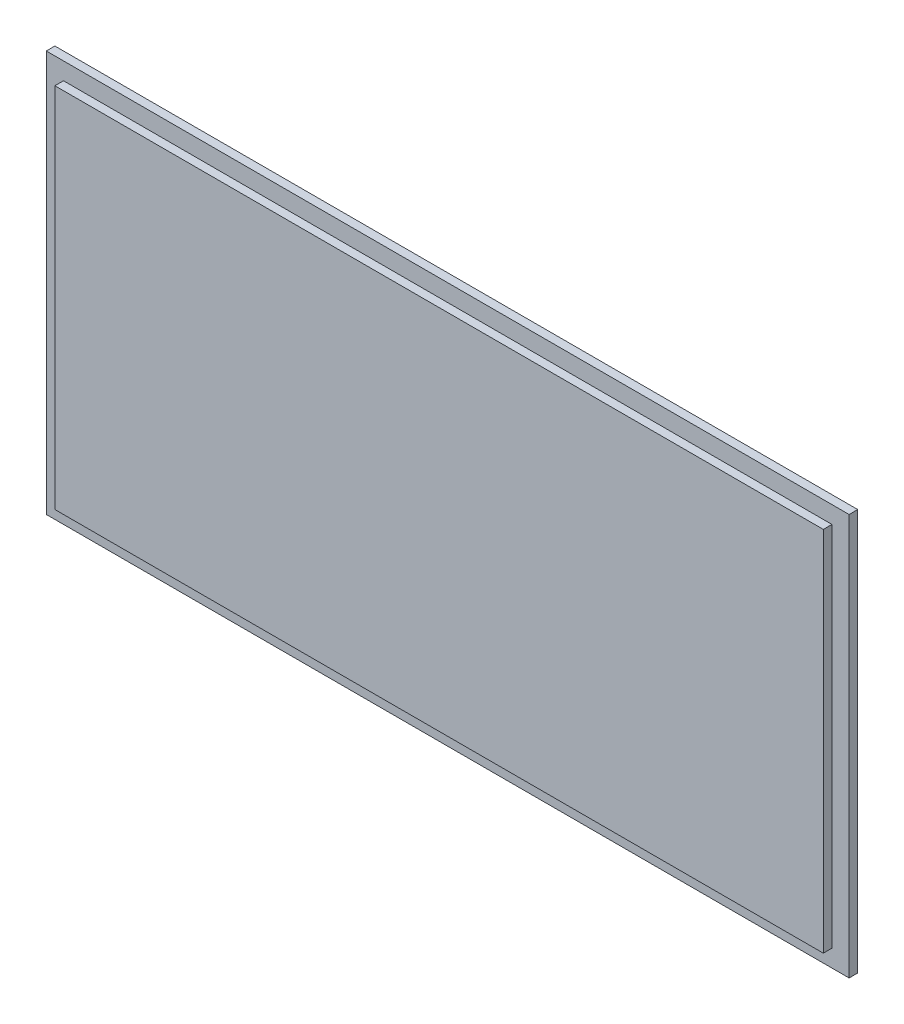
ISO-10303-21;
HEADER;
FILE_DESCRIPTION(('STEP AP214'),'2;1');
FILE_NAME('part.step','',(''),(''),'','','');
FILE_SCHEMA(('AUTOMOTIVE_DESIGN { 1 0 10303 214 1 1 1 1 }'));
ENDSEC;
DATA;
#1=APPLICATION_CONTEXT('core data for automotive mechanical design processes');
#2=APPLICATION_PROTOCOL_DEFINITION('international standard','automotive_design',2000,#1);
#3=PRODUCT_CONTEXT('',#1,'mechanical');
#4=PRODUCT('Part','Part','',(#3));
#5=PRODUCT_RELATED_PRODUCT_CATEGORY('part','',(#4));
#6=PRODUCT_DEFINITION_FORMATION('','',#4);
#7=PRODUCT_DEFINITION_CONTEXT('part definition',#1,'design');
#8=PRODUCT_DEFINITION('design','',#6,#7);
#9=PRODUCT_DEFINITION_SHAPE('','',#8);
#10=(LENGTH_UNIT() NAMED_UNIT(*) SI_UNIT(.MILLI.,.METRE.));
#11=(NAMED_UNIT(*) PLANE_ANGLE_UNIT() SI_UNIT($,.RADIAN.));
#12=(NAMED_UNIT(*) SI_UNIT($,.STERADIAN.) SOLID_ANGLE_UNIT());
#13=UNCERTAINTY_MEASURE_WITH_UNIT(LENGTH_MEASURE(1.E-05),#10,'distance_accuracy_value','');
#14=(GEOMETRIC_REPRESENTATION_CONTEXT(3) GLOBAL_UNCERTAINTY_ASSIGNED_CONTEXT((#13)) GLOBAL_UNIT_ASSIGNED_CONTEXT((#10,
#11,#12)) REPRESENTATION_CONTEXT('',''));
#15=CARTESIAN_POINT('',(0.,0.,0.));
#16=DIRECTION('',(0.,0.,1.));
#17=DIRECTION('',(1.,0.,0.));
#18=AXIS2_PLACEMENT_3D('',#15,#16,#17);
#19=CARTESIAN_POINT('',(-66.450119474313,35.3653922739944,1.5));
#20=DIRECTION('',(1.,0.,0.));
#21=DIRECTION('',(0.,0.,-1.));
#22=AXIS2_PLACEMENT_3D('',#19,#20,#21);
#23=PLANE('',#22);
#24=DIRECTION('',(0.,-1.,0.));
#25=VECTOR('',#24,1.);
#26=CARTESIAN_POINT('',(-66.450119474313,35.3653922739944,0.));
#27=LINE('',#26,#25);
#28=CARTESIAN_POINT('',(-66.450119474313,35.3653922739944,0.));
#29=VERTEX_POINT('',#28);
#30=CARTESIAN_POINT('',(-66.450119474313,-34.6346077260056,0.));
#31=VERTEX_POINT('',#30);
#32=EDGE_CURVE('E129',#29,#31,#27,.T.);
#33=ORIENTED_EDGE('',*,*,#32,.T.);
#34=DIRECTION('',(0.,0.,-1.));
#35=VECTOR('',#34,1.);
#36=CARTESIAN_POINT('',(-66.450119474313,-34.6346077260056,1.5));
#37=LINE('',#36,#35);
#38=CARTESIAN_POINT('',(-66.450119474313,-34.6346077260056,1.5));
#39=VERTEX_POINT('',#38);
#40=EDGE_CURVE('E11',#39,#31,#37,.T.);
#41=ORIENTED_EDGE('',*,*,#40,.F.);
#42=DIRECTION('',(0.,-1.,0.));
#43=VECTOR('',#42,1.);
#44=CARTESIAN_POINT('',(-66.450119474313,35.3653922739944,1.5));
#45=LINE('',#44,#43);
#46=CARTESIAN_POINT('',(-66.450119474313,35.3653922739944,1.5));
#47=VERTEX_POINT('',#46);
#48=EDGE_CURVE('E150',#47,#39,#45,.T.);
#49=ORIENTED_EDGE('',*,*,#48,.F.);
#50=DIRECTION('',(0.,0.,-1.));
#51=VECTOR('',#50,1.);
#52=CARTESIAN_POINT('',(-66.450119474313,35.3653922739944,1.5));
#53=LINE('',#52,#51);
#54=EDGE_CURVE('E156',#47,#29,#53,.T.);
#55=ORIENTED_EDGE('',*,*,#54,.T.);
#56=EDGE_LOOP('',(#33,#41,#49,#55));
#57=FACE_BOUND('',#56,.T.);
#58=ADVANCED_FACE('F38',(#57),#23,.F.);
#59=CARTESIAN_POINT('',(-66.450119474313,-34.6346077260056,1.5));
#60=DIRECTION('',(0.,1.,0.));
#61=DIRECTION('',(0.,0.,1.));
#62=AXIS2_PLACEMENT_3D('',#59,#60,#61);
#63=PLANE('',#62);
#64=DIRECTION('',(1.,0.,0.));
#65=VECTOR('',#64,1.);
#66=CARTESIAN_POINT('',(-66.450119474313,-34.6346077260056,0.));
#67=LINE('',#66,#65);
#68=CARTESIAN_POINT('',(73.549880525687,-34.6346077260056,0.));
#69=VERTEX_POINT('',#68);
#70=EDGE_CURVE('E159',#31,#69,#67,.T.);
#71=ORIENTED_EDGE('',*,*,#70,.T.);
#72=DIRECTION('',(0.,0.,-1.));
#73=VECTOR('',#72,1.);
#74=CARTESIAN_POINT('',(73.549880525687,-34.6346077260056,1.5));
#75=LINE('',#74,#73);
#76=CARTESIAN_POINT('',(73.549880525687,-34.6346077260056,1.5));
#77=VERTEX_POINT('',#76);
#78=EDGE_CURVE('E45',#77,#69,#75,.T.);
#79=ORIENTED_EDGE('',*,*,#78,.F.);
#80=DIRECTION('',(1.,0.,0.));
#81=VECTOR('',#80,1.);
#82=CARTESIAN_POINT('',(-66.450119474313,-34.6346077260056,1.5));
#83=LINE('',#82,#81);
#84=EDGE_CURVE('E89',#39,#77,#83,.T.);
#85=ORIENTED_EDGE('',*,*,#84,.F.);
#86=ORIENTED_EDGE('',*,*,#40,.T.);
#87=EDGE_LOOP('',(#71,#79,#85,#86));
#88=FACE_BOUND('',#87,.T.);
#89=ADVANCED_FACE('F188',(#88),#63,.F.);
#90=CARTESIAN_POINT('',(73.549880525687,35.3653922739944,1.5));
#91=DIRECTION('',(-1.,0.,0.));
#92=DIRECTION('',(0.,0.,1.));
#93=AXIS2_PLACEMENT_3D('',#90,#91,#92);
#94=PLANE('',#93);
#95=DIRECTION('',(0.,1.,0.));
#96=VECTOR('',#95,1.);
#97=CARTESIAN_POINT('',(73.549880525687,35.3653922739944,0.));
#98=LINE('',#97,#96);
#99=CARTESIAN_POINT('',(73.549880525687,35.3653922739944,0.));
#100=VERTEX_POINT('',#99);
#101=EDGE_CURVE('E161',#69,#100,#98,.T.);
#102=ORIENTED_EDGE('',*,*,#101,.T.);
#103=DIRECTION('',(0.,0.,-1.));
#104=VECTOR('',#103,1.);
#105=CARTESIAN_POINT('',(73.549880525687,35.3653922739944,1.5));
#106=LINE('',#105,#104);
#107=CARTESIAN_POINT('',(73.549880525687,35.3653922739944,1.5));
#108=VERTEX_POINT('',#107);
#109=EDGE_CURVE('E165',#108,#100,#106,.T.);
#110=ORIENTED_EDGE('',*,*,#109,.F.);
#111=DIRECTION('',(0.,1.,0.));
#112=VECTOR('',#111,1.);
#113=CARTESIAN_POINT('',(73.549880525687,35.3653922739944,1.5));
#114=LINE('',#113,#112);
#115=EDGE_CURVE('E153',#77,#108,#114,.T.);
#116=ORIENTED_EDGE('',*,*,#115,.F.);
#117=ORIENTED_EDGE('',*,*,#78,.T.);
#118=EDGE_LOOP('',(#102,#110,#116,#117));
#119=FACE_BOUND('',#118,.T.);
#120=ADVANCED_FACE('F170',(#119),#94,.F.);
#121=CARTESIAN_POINT('',(-66.450119474313,35.3653922739944,1.5));
#122=DIRECTION('',(0.,-1.,0.));
#123=DIRECTION('',(0.,0.,-1.));
#124=AXIS2_PLACEMENT_3D('',#121,#122,#123);
#125=PLANE('',#124);
#126=DIRECTION('',(-1.,0.,0.));
#127=VECTOR('',#126,1.);
#128=CARTESIAN_POINT('',(-66.450119474313,35.3653922739944,0.));
#129=LINE('',#128,#127);
#130=EDGE_CURVE('E82',#100,#29,#129,.T.);
#131=ORIENTED_EDGE('',*,*,#130,.T.);
#132=ORIENTED_EDGE('',*,*,#54,.F.);
#133=DIRECTION('',(-1.,0.,0.));
#134=VECTOR('',#133,1.);
#135=CARTESIAN_POINT('',(-66.450119474313,35.3653922739944,1.5));
#136=LINE('',#135,#134);
#137=EDGE_CURVE('E61',#108,#47,#136,.T.);
#138=ORIENTED_EDGE('',*,*,#137,.F.);
#139=ORIENTED_EDGE('',*,*,#109,.T.);
#140=EDGE_LOOP('',(#131,#132,#138,#139));
#141=FACE_BOUND('',#140,.T.);
#142=ADVANCED_FACE('F178',(#141),#125,.F.);
#143=CARTESIAN_POINT('',(0.,0.,1.5));
#144=DIRECTION('',(0.,0.,1.));
#145=DIRECTION('',(1.,0.,0.));
#146=AXIS2_PLACEMENT_3D('',#143,#144,#145);
#147=PLANE('',#146);
#148=DIRECTION('',(1.,0.,0.));
#149=VECTOR('',#148,1.);
#150=CARTESIAN_POINT('',(-63.450119474313,-31.6346077260056,1.5));
#151=LINE('',#150,#149);
#152=CARTESIAN_POINT('',(-63.450119474313,-31.6346077260056,1.5));
#153=VERTEX_POINT('',#152);
#154=CARTESIAN_POINT('',(70.549880525687,-31.6346077260056,1.5));
#155=VERTEX_POINT('',#154);
#156=EDGE_CURVE('E52',#153,#155,#151,.T.);
#157=ORIENTED_EDGE('',*,*,#156,.F.);
#158=DIRECTION('',(0.,-1.,0.));
#159=VECTOR('',#158,1.);
#160=CARTESIAN_POINT('',(-63.450119474313,32.3653922739944,1.5));
#161=LINE('',#160,#159);
#162=CARTESIAN_POINT('',(-63.450119474313,32.3653922739944,1.5));
#163=VERTEX_POINT('',#162);
#164=EDGE_CURVE('E122',#163,#153,#161,.T.);
#165=ORIENTED_EDGE('',*,*,#164,.F.);
#166=DIRECTION('',(1.,0.,0.));
#167=VECTOR('',#166,1.);
#168=CARTESIAN_POINT('',(-63.450119474313,32.3653922739944,1.5));
#169=LINE('',#168,#167);
#170=CARTESIAN_POINT('',(70.549880525687,32.3653922739944,1.5));
#171=VERTEX_POINT('',#170);
#172=EDGE_CURVE('E142',#163,#171,#169,.T.);
#173=ORIENTED_EDGE('',*,*,#172,.T.);
#174=DIRECTION('',(0.,-1.,0.));
#175=VECTOR('',#174,1.);
#176=CARTESIAN_POINT('',(70.549880525687,32.3653922739944,1.5));
#177=LINE('',#176,#175);
#178=EDGE_CURVE('E140',#171,#155,#177,.T.);
#179=ORIENTED_EDGE('',*,*,#178,.T.);
#180=EDGE_LOOP('',(#157,#165,#173,#179));
#181=FACE_BOUND('',#180,.T.);
#182=ORIENTED_EDGE('',*,*,#48,.T.);
#183=ORIENTED_EDGE('',*,*,#84,.T.);
#184=ORIENTED_EDGE('',*,*,#115,.T.);
#185=ORIENTED_EDGE('',*,*,#137,.T.);
#186=EDGE_LOOP('',(#182,#183,#184,#185));
#187=FACE_BOUND('',#186,.T.);
#188=ADVANCED_FACE('F180',(#181,#187),#147,.T.);
#189=CARTESIAN_POINT('',(0.,0.,0.));
#190=DIRECTION('',(0.,0.,1.));
#191=DIRECTION('',(1.,0.,0.));
#192=AXIS2_PLACEMENT_3D('',#189,#190,#191);
#193=PLANE('',#192);
#194=ORIENTED_EDGE('',*,*,#32,.F.);
#195=ORIENTED_EDGE('',*,*,#130,.F.);
#196=ORIENTED_EDGE('',*,*,#101,.F.);
#197=ORIENTED_EDGE('',*,*,#70,.F.);
#198=EDGE_LOOP('',(#194,#195,#196,#197));
#199=FACE_BOUND('',#198,.T.);
#200=ADVANCED_FACE('F174',(#199),#193,.F.);
#201=CARTESIAN_POINT('',(-63.450119474313,-31.6346077260056,3.));
#202=DIRECTION('',(0.,1.,0.));
#203=DIRECTION('',(0.,0.,1.));
#204=AXIS2_PLACEMENT_3D('',#201,#202,#203);
#205=PLANE('',#204);
#206=ORIENTED_EDGE('',*,*,#156,.T.);
#207=DIRECTION('',(0.,0.,-1.));
#208=VECTOR('',#207,1.);
#209=CARTESIAN_POINT('',(70.549880525687,-31.6346077260056,3.));
#210=LINE('',#209,#208);
#211=CARTESIAN_POINT('',(70.549880525687,-31.6346077260056,3.));
#212=VERTEX_POINT('',#211);
#213=EDGE_CURVE('E124',#212,#155,#210,.T.);
#214=ORIENTED_EDGE('',*,*,#213,.F.);
#215=DIRECTION('',(1.,0.,0.));
#216=VECTOR('',#215,1.);
#217=CARTESIAN_POINT('',(-63.450119474313,-31.6346077260056,3.));
#218=LINE('',#217,#216);
#219=CARTESIAN_POINT('',(-63.450119474313,-31.6346077260056,3.));
#220=VERTEX_POINT('',#219);
#221=EDGE_CURVE('E113',#220,#212,#218,.T.);
#222=ORIENTED_EDGE('',*,*,#221,.F.);
#223=DIRECTION('',(0.,0.,-1.));
#224=VECTOR('',#223,1.);
#225=CARTESIAN_POINT('',(-63.450119474313,-31.6346077260056,3.));
#226=LINE('',#225,#224);
#227=EDGE_CURVE('E138',#220,#153,#226,.T.);
#228=ORIENTED_EDGE('',*,*,#227,.T.);
#229=EDGE_LOOP('',(#206,#214,#222,#228));
#230=FACE_BOUND('',#229,.T.);
#231=ADVANCED_FACE('F125',(#230),#205,.F.);
#232=CARTESIAN_POINT('',(70.549880525687,32.3653922739944,3.));
#233=DIRECTION('',(1.,0.,0.));
#234=DIRECTION('',(0.,0.,-1.));
#235=AXIS2_PLACEMENT_3D('',#232,#233,#234);
#236=PLANE('',#235);
#237=ORIENTED_EDGE('',*,*,#178,.F.);
#238=DIRECTION('',(0.,0.,-1.));
#239=VECTOR('',#238,1.);
#240=CARTESIAN_POINT('',(70.549880525687,32.3653922739944,3.));
#241=LINE('',#240,#239);
#242=CARTESIAN_POINT('',(70.549880525687,32.3653922739944,3.));
#243=VERTEX_POINT('',#242);
#244=EDGE_CURVE('E130',#243,#171,#241,.T.);
#245=ORIENTED_EDGE('',*,*,#244,.F.);
#246=DIRECTION('',(0.,-1.,0.));
#247=VECTOR('',#246,1.);
#248=CARTESIAN_POINT('',(70.549880525687,32.3653922739944,3.));
#249=LINE('',#248,#247);
#250=EDGE_CURVE('E117',#243,#212,#249,.T.);
#251=ORIENTED_EDGE('',*,*,#250,.T.);
#252=ORIENTED_EDGE('',*,*,#213,.T.);
#253=EDGE_LOOP('',(#237,#245,#251,#252));
#254=FACE_BOUND('',#253,.T.);
#255=ADVANCED_FACE('F132',(#254),#236,.T.);
#256=CARTESIAN_POINT('',(-63.450119474313,32.3653922739944,3.));
#257=DIRECTION('',(0.,1.,0.));
#258=DIRECTION('',(0.,0.,1.));
#259=AXIS2_PLACEMENT_3D('',#256,#257,#258);
#260=PLANE('',#259);
#261=ORIENTED_EDGE('',*,*,#172,.F.);
#262=DIRECTION('',(0.,0.,-1.));
#263=VECTOR('',#262,1.);
#264=CARTESIAN_POINT('',(-63.450119474313,32.3653922739944,3.));
#265=LINE('',#264,#263);
#266=CARTESIAN_POINT('',(-63.450119474313,32.3653922739944,3.));
#267=VERTEX_POINT('',#266);
#268=EDGE_CURVE('E147',#267,#163,#265,.T.);
#269=ORIENTED_EDGE('',*,*,#268,.F.);
#270=DIRECTION('',(1.,0.,0.));
#271=VECTOR('',#270,1.);
#272=CARTESIAN_POINT('',(-63.450119474313,32.3653922739944,3.));
#273=LINE('',#272,#271);
#274=EDGE_CURVE('E133',#267,#243,#273,.T.);
#275=ORIENTED_EDGE('',*,*,#274,.T.);
#276=ORIENTED_EDGE('',*,*,#244,.T.);
#277=EDGE_LOOP('',(#261,#269,#275,#276));
#278=FACE_BOUND('',#277,.T.);
#279=ADVANCED_FACE('F235',(#278),#260,.T.);
#280=CARTESIAN_POINT('',(-63.450119474313,32.3653922739944,3.));
#281=DIRECTION('',(1.,0.,0.));
#282=DIRECTION('',(0.,1.,0.));
#283=AXIS2_PLACEMENT_3D('',#280,#281,#282);
#284=PLANE('',#283);
#285=ORIENTED_EDGE('',*,*,#164,.T.);
#286=ORIENTED_EDGE('',*,*,#227,.F.);
#287=DIRECTION('',(0.,-1.,0.));
#288=VECTOR('',#287,1.);
#289=CARTESIAN_POINT('',(-63.450119474313,32.3653922739944,3.));
#290=LINE('',#289,#288);
#291=EDGE_CURVE('E120',#267,#220,#290,.T.);
#292=ORIENTED_EDGE('',*,*,#291,.F.);
#293=ORIENTED_EDGE('',*,*,#268,.T.);
#294=EDGE_LOOP('',(#285,#286,#292,#293));
#295=FACE_BOUND('',#294,.T.);
#296=ADVANCED_FACE('F244',(#295),#284,.F.);
#297=CARTESIAN_POINT('',(0.,0.,3.));
#298=DIRECTION('',(0.,0.,-1.));
#299=DIRECTION('',(-1.,0.,0.));
#300=AXIS2_PLACEMENT_3D('',#297,#298,#299);
#301=PLANE('',#300);
#302=ORIENTED_EDGE('',*,*,#221,.T.);
#303=ORIENTED_EDGE('',*,*,#250,.F.);
#304=ORIENTED_EDGE('',*,*,#274,.F.);
#305=ORIENTED_EDGE('',*,*,#291,.T.);
#306=EDGE_LOOP('',(#302,#303,#304,#305));
#307=FACE_BOUND('',#306,.T.);
#308=ADVANCED_FACE('F114',(#307),#301,.F.);
#309=CLOSED_SHELL('',(#58,#89,#120,#142,#188,#200,#231,#255,#279,#296,#308));
#310=MANIFOLD_SOLID_BREP('B2',#309);
#311=ADVANCED_BREP_SHAPE_REPRESENTATION('',(#18,#310),#14);
#312=SHAPE_DEFINITION_REPRESENTATION(#9,#311);
ENDSEC;
END-ISO-10303-21;
